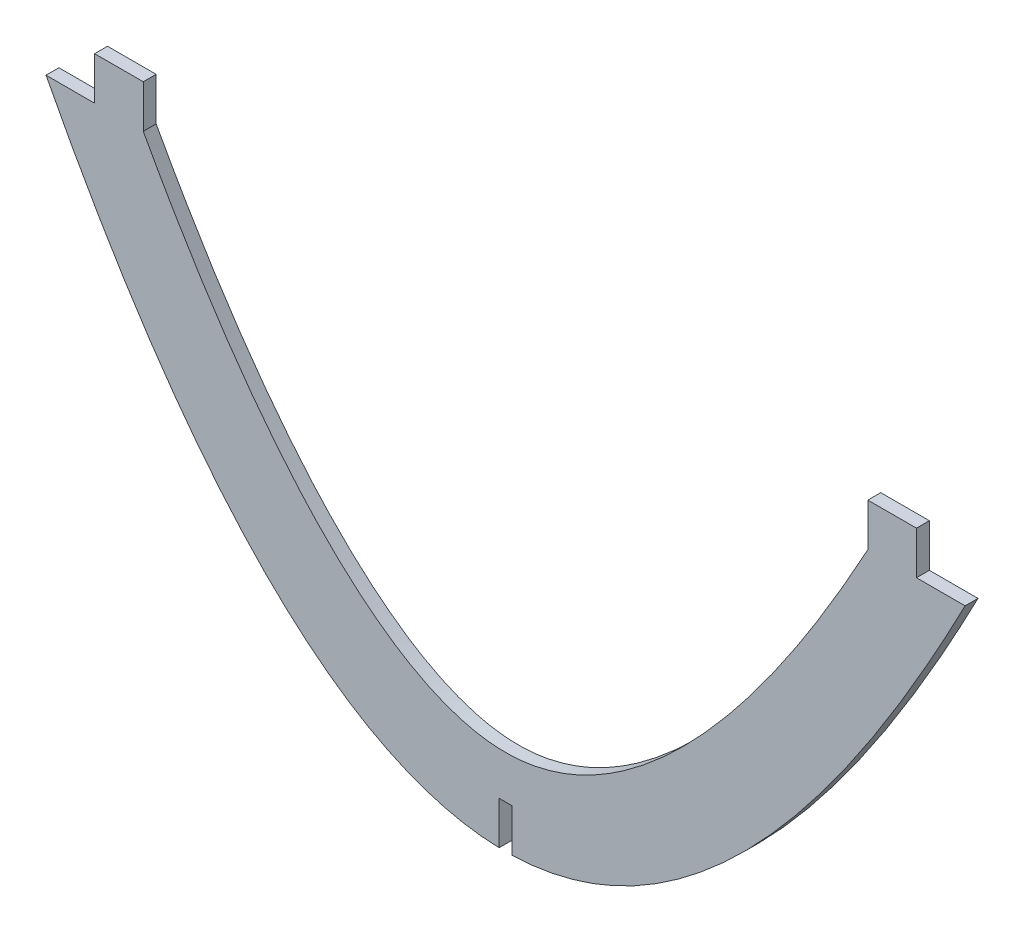
ISO-10303-21;
HEADER;
FILE_DESCRIPTION(('STEP AP214'),'2;1');
FILE_NAME('part.step','',(''),(''),'','','');
FILE_SCHEMA(('AUTOMOTIVE_DESIGN { 1 0 10303 214 1 1 1 1 }'));
ENDSEC;
DATA;
#1=APPLICATION_CONTEXT('core data for automotive mechanical design processes');
#2=APPLICATION_PROTOCOL_DEFINITION('international standard','automotive_design',2000,#1);
#3=PRODUCT_CONTEXT('',#1,'mechanical');
#4=PRODUCT('Part','Part','',(#3));
#5=PRODUCT_RELATED_PRODUCT_CATEGORY('part','',(#4));
#6=PRODUCT_DEFINITION_FORMATION('','',#4);
#7=PRODUCT_DEFINITION_CONTEXT('part definition',#1,'design');
#8=PRODUCT_DEFINITION('design','',#6,#7);
#9=PRODUCT_DEFINITION_SHAPE('','',#8);
#10=(LENGTH_UNIT() NAMED_UNIT(*) SI_UNIT(.MILLI.,.METRE.));
#11=(NAMED_UNIT(*) PLANE_ANGLE_UNIT() SI_UNIT($,.RADIAN.));
#12=(NAMED_UNIT(*) SI_UNIT($,.STERADIAN.) SOLID_ANGLE_UNIT());
#13=UNCERTAINTY_MEASURE_WITH_UNIT(LENGTH_MEASURE(1.E-05),#10,'distance_accuracy_value','');
#14=(GEOMETRIC_REPRESENTATION_CONTEXT(3) GLOBAL_UNCERTAINTY_ASSIGNED_CONTEXT((#13)) GLOBAL_UNIT_ASSIGNED_CONTEXT((#10,
#11,#12)) REPRESENTATION_CONTEXT('',''));
#15=CARTESIAN_POINT('',(0.,0.,0.));
#16=DIRECTION('',(0.,0.,1.));
#17=DIRECTION('',(1.,0.,0.));
#18=AXIS2_PLACEMENT_3D('',#15,#16,#17);
#19=CARTESIAN_POINT('',(-107.013116357136,103.066263652194,3.));
#20=CARTESIAN_POINT('',(-1.33244110189779E-11,-103.066263652168,3.));
#21=CARTESIAN_POINT('',(107.01311635711,103.066263652143,3.));
#22=B_SPLINE_CURVE_WITH_KNOTS('',2,(#19,#20,#21),.UNSPECIFIED.,.F.,.F.,(3,3),
(0.0571574881341071,0.942842511865783),.UNSPECIFIED.);
#23=DIRECTION('',(0.,0.,-1.));
#24=VECTOR('',#23,1.);
#25=SURFACE_OF_LINEAR_EXTRUSION('',#22,#24);
#26=DIRECTION('',(0.,0.,-1.));
#27=VECTOR('',#26,1.);
#28=CARTESIAN_POINT('',(1.5,0.0202500000000064,3.));
#29=LINE('',#28,#27);
#30=CARTESIAN_POINT('',(1.5,0.0202500000000064,0.));
#31=VERTEX_POINT('',#30);
#32=CARTESIAN_POINT('',(1.5,0.0202500000000064,3.));
#33=VERTEX_POINT('',#32);
#34=EDGE_CURVE('E174',#31,#33,#29,.F.);
#35=ORIENTED_EDGE('',*,*,#34,.F.);
#36=CARTESIAN_POINT('',(-107.013116357136,103.066263652194,0.));
#37=CARTESIAN_POINT('',(-1.33244110189779E-11,-103.066263652168,0.));
#38=CARTESIAN_POINT('',(107.01311635711,103.066263652143,0.));
#39=B_SPLINE_CURVE_WITH_KNOTS('',2,(#36,#37,#38),.UNSPECIFIED.,.F.,.F.,(3,3),
(0.0571574881341071,0.942842511865783),.UNSPECIFIED.);
#40=CARTESIAN_POINT('',(107.01311635711,103.066263652143,0.));
#41=VERTEX_POINT('',#40);
#42=EDGE_CURVE('E177',#31,#41,#39,.T.);
#43=ORIENTED_EDGE('',*,*,#42,.T.);
#44=DIRECTION('',(0.,0.,-1.));
#45=VECTOR('',#44,1.);
#46=CARTESIAN_POINT('',(107.01311635711,103.066263652143,3.));
#47=LINE('',#46,#45);
#48=CARTESIAN_POINT('',(107.01311635711,103.066263652143,3.));
#49=VERTEX_POINT('',#48);
#50=EDGE_CURVE('E230',#49,#41,#47,.T.);
#51=ORIENTED_EDGE('',*,*,#50,.F.);
#52=EDGE_CURVE('E258',#33,#49,#22,.T.);
#53=ORIENTED_EDGE('',*,*,#52,.F.);
#54=EDGE_LOOP('',(#35,#43,#51,#53));
#55=FACE_BOUND('',#54,.T.);
#56=ADVANCED_FACE('F39',(#55),#25,.F.);
#57=DIRECTION('',(0.,0.,-1.));
#58=VECTOR('',#57,1.);
#59=CARTESIAN_POINT('',(-1.5,0.0202500000000042,3.));
#60=LINE('',#59,#58);
#61=CARTESIAN_POINT('',(-1.5,0.0202500000000029,3.));
#62=VERTEX_POINT('',#61);
#63=CARTESIAN_POINT('',(-1.49999999999998,0.0202500000000034,0.));
#64=VERTEX_POINT('',#63);
#65=EDGE_CURVE('E55',#62,#64,#60,.T.);
#66=ORIENTED_EDGE('',*,*,#65,.F.);
#67=CARTESIAN_POINT('',(-107.013116357096,103.066263652122,3.));
#68=VERTEX_POINT('',#67);
#69=EDGE_CURVE('E254',#68,#62,#22,.T.);
#70=ORIENTED_EDGE('',*,*,#69,.F.);
#71=DIRECTION('',(0.,0.,-1.));
#72=VECTOR('',#71,1.);
#73=CARTESIAN_POINT('',(-107.013116357096,103.066263652122,3.));
#74=LINE('',#73,#72);
#75=CARTESIAN_POINT('',(-107.013116357096,103.066263652122,0.));
#76=VERTEX_POINT('',#75);
#77=EDGE_CURVE('E234',#68,#76,#74,.T.);
#78=ORIENTED_EDGE('',*,*,#77,.T.);
#79=EDGE_CURVE('E178',#76,#64,#39,.T.);
#80=ORIENTED_EDGE('',*,*,#79,.T.);
#81=EDGE_LOOP('',(#66,#70,#78,#80));
#82=FACE_BOUND('',#81,.T.);
#83=ADVANCED_FACE('F250',(#82),#25,.F.);
#84=CARTESIAN_POINT('',(-2.89867206253527E-05,19.9974258890682,3.));
#85=DIRECTION('',(0.,0.,-1.));
#86=DIRECTION('',(-1.,0.,0.));
#87=AXIS2_PLACEMENT_3D('',#84,#85,#86);
#88=PLANE('',#87);
#89=DIRECTION('',(0.,1.,0.));
#90=VECTOR('',#89,1.);
#91=CARTESIAN_POINT('',(1.5,19.9974258890682,3.));
#92=LINE('',#91,#90);
#93=CARTESIAN_POINT('',(1.5,10.,3.));
#94=VERTEX_POINT('',#93);
#95=EDGE_CURVE('E341',#33,#94,#92,.T.);
#96=ORIENTED_EDGE('',*,*,#95,.F.);
#97=ORIENTED_EDGE('',*,*,#52,.T.);
#98=DIRECTION('',(-1.,0.,0.));
#99=VECTOR('',#98,1.);
#100=CARTESIAN_POINT('',(107.013116357624,103.066263651914,3.));
#101=LINE('',#100,#99);
#102=CARTESIAN_POINT('',(95.6876138200233,103.066263651914,3.));
#103=VERTEX_POINT('',#102);
#104=EDGE_CURVE('E257',#49,#103,#101,.T.);
#105=ORIENTED_EDGE('',*,*,#104,.T.);
#106=DIRECTION('',(0.,1.,0.));
#107=VECTOR('',#106,1.);
#108=CARTESIAN_POINT('',(95.6876138200233,103.066263651914,3.));
#109=LINE('',#108,#107);
#110=CARTESIAN_POINT('',(95.6876138200233,113.066263652122,3.));
#111=VERTEX_POINT('',#110);
#112=EDGE_CURVE('E262',#103,#111,#109,.T.);
#113=ORIENTED_EDGE('',*,*,#112,.T.);
#114=DIRECTION('',(-1.,0.,0.));
#115=VECTOR('',#114,1.);
#116=CARTESIAN_POINT('',(95.6876138200233,113.066263652122,3.));
#117=LINE('',#116,#115);
#118=CARTESIAN_POINT('',(84.3621112824562,113.066263652122,3.));
#119=VERTEX_POINT('',#118);
#120=EDGE_CURVE('E323',#111,#119,#117,.T.);
#121=ORIENTED_EDGE('',*,*,#120,.T.);
#122=DIRECTION('',(0.,-1.,0.));
#123=VECTOR('',#122,1.);
#124=CARTESIAN_POINT('',(84.3621112824562,113.066263652122,3.));
#125=LINE('',#124,#123);
#126=CARTESIAN_POINT('',(84.3621112824562,103.066263652122,3.));
#127=VERTEX_POINT('',#126);
#128=EDGE_CURVE('E141',#119,#127,#125,.T.);
#129=ORIENTED_EDGE('',*,*,#128,.T.);
#130=CARTESIAN_POINT('',(89.264302067395,112.280702786458,3.));
#131=CARTESIAN_POINT('',(79.5729293370875,93.6297958532127,3.));
#132=CARTESIAN_POINT('',(60.6179731356507,63.9838720263794,3.));
#133=CARTESIAN_POINT('',(42.3691023724988,42.101536816968,3.));
#134=CARTESIAN_POINT('',(28.3080655702787,30.2983221378807,3.));
#135=CARTESIAN_POINT('',(17.9499260738012,24.1014430822762,3.));
#136=CARTESIAN_POINT('',(8.6016754251648,20.7622263557387,3.));
#137=CARTESIAN_POINT('',(-2.48932874152704E-05,19.7424947590042,3.));
#138=CARTESIAN_POINT('',(-8.60175795920534,20.7622122027813,3.));
#139=CARTESIAN_POINT('',(-17.949851696721,24.1014717277478,3.));
#140=CARTESIAN_POINT('',(-28.3089219590435,30.2980474329665,3.));
#141=CARTESIAN_POINT('',(-39.5523641363937,39.7423295411056,3.));
#142=CARTESIAN_POINT('',(-51.4440372597663,52.6053043581572,3.));
#143=CARTESIAN_POINT('',(-63.7789984766565,68.9258403154481,3.));
#144=CARTESIAN_POINT('',(-79.5722889840756,93.6292889473318,3.));
#145=CARTESIAN_POINT('',(-89.2644346965336,112.28063057416,3.));
#146=B_SPLINE_CURVE_WITH_KNOTS('',2,(#130,#131,#132,#133,#134,#135,#136,#137,#138,#139,#140,
#141,#142,#143,#144,#145),.UNSPECIFIED.,.F.,.F.,(3,1,1,1,1,1,1,1,1,1,1,1,1,1,3),
(0.0571574881320589,0.140190459107088,0.223223430082116,0.306256401057144,0.361611715040497,
0.416967029023849,0.472322343007202,0.527677656990554,0.583032970973906,0.638388284957259,
0.693743598940611,0.749098912923963,0.804454226907316,0.859809540890668,0.942842511865697),.UNSPECIFIED.);
#147=CARTESIAN_POINT('',(-84.3621112816881,103.066263651876,3.));
#148=VERTEX_POINT('',#147);
#149=EDGE_CURVE('E133',#127,#148,#146,.T.);
#150=ORIENTED_EDGE('',*,*,#149,.T.);
#151=DIRECTION('',(0.,1.,0.));
#152=VECTOR('',#151,1.);
#153=CARTESIAN_POINT('',(-84.3621112816882,113.066263652122,3.));
#154=LINE('',#153,#152);
#155=CARTESIAN_POINT('',(-84.3621112816882,113.066263652122,3.));
#156=VERTEX_POINT('',#155);
#157=EDGE_CURVE('E138',#148,#156,#154,.T.);
#158=ORIENTED_EDGE('',*,*,#157,.T.);
#159=DIRECTION('',(-1.,0.,0.));
#160=VECTOR('',#159,1.);
#161=CARTESIAN_POINT('',(-95.6876138194566,113.066263652122,3.));
#162=LINE('',#161,#160);
#163=CARTESIAN_POINT('',(-95.6876138194566,113.066263652122,3.));
#164=VERTEX_POINT('',#163);
#165=EDGE_CURVE('E64',#156,#164,#162,.T.);
#166=ORIENTED_EDGE('',*,*,#165,.T.);
#167=DIRECTION('',(0.,-1.,0.));
#168=VECTOR('',#167,1.);
#169=CARTESIAN_POINT('',(-95.6876138194566,103.066263652122,3.));
#170=LINE('',#169,#168);
#171=CARTESIAN_POINT('',(-95.6876138194566,103.066263652122,3.));
#172=VERTEX_POINT('',#171);
#173=EDGE_CURVE('E211',#164,#172,#170,.T.);
#174=ORIENTED_EDGE('',*,*,#173,.T.);
#175=DIRECTION('',(-1.,0.,0.));
#176=VECTOR('',#175,1.);
#177=CARTESIAN_POINT('',(-107.013116357096,103.066263652122,3.));
#178=LINE('',#177,#176);
#179=EDGE_CURVE('E112',#172,#68,#178,.T.);
#180=ORIENTED_EDGE('',*,*,#179,.T.);
#181=ORIENTED_EDGE('',*,*,#69,.T.);
#182=DIRECTION('',(0.,-1.,0.));
#183=VECTOR('',#182,1.);
#184=CARTESIAN_POINT('',(-1.5,19.9974258890682,3.));
#185=LINE('',#184,#183);
#186=CARTESIAN_POINT('',(-1.5,10.,3.));
#187=VERTEX_POINT('',#186);
#188=EDGE_CURVE('E351',#187,#62,#185,.T.);
#189=ORIENTED_EDGE('',*,*,#188,.F.);
#190=DIRECTION('',(-1.,0.,0.));
#191=VECTOR('',#190,1.);
#192=CARTESIAN_POINT('',(-2.89867206253527E-05,10.,3.));
#193=LINE('',#192,#191);
#194=EDGE_CURVE('E345',#94,#187,#193,.T.);
#195=ORIENTED_EDGE('',*,*,#194,.F.);
#196=EDGE_LOOP('',(#96,#97,#105,#113,#121,#129,#150,#158,#166,#174,#180,#181,#189,#195));
#197=FACE_BOUND('',#196,.T.);
#198=ADVANCED_FACE('F136',(#197),#88,.F.);
#199=CARTESIAN_POINT('',(-2.89867206253527E-05,19.9974258890682,0.));
#200=DIRECTION('',(0.,0.,-1.));
#201=DIRECTION('',(-1.,0.,0.));
#202=AXIS2_PLACEMENT_3D('',#199,#200,#201);
#203=PLANE('',#202);
#204=ORIENTED_EDGE('',*,*,#42,.F.);
#205=DIRECTION('',(0.,1.,0.));
#206=VECTOR('',#205,1.);
#207=CARTESIAN_POINT('',(1.5,19.9974258890682,0.));
#208=LINE('',#207,#206);
#209=CARTESIAN_POINT('',(1.5,10.,0.));
#210=VERTEX_POINT('',#209);
#211=EDGE_CURVE('E11',#31,#210,#208,.T.);
#212=ORIENTED_EDGE('',*,*,#211,.T.);
#213=DIRECTION('',(-1.,0.,0.));
#214=VECTOR('',#213,1.);
#215=CARTESIAN_POINT('',(-1.5,10.,0.));
#216=LINE('',#215,#214);
#217=CARTESIAN_POINT('',(-1.5,10.,0.));
#218=VERTEX_POINT('',#217);
#219=EDGE_CURVE('E364',#210,#218,#216,.T.);
#220=ORIENTED_EDGE('',*,*,#219,.T.);
#221=DIRECTION('',(0.,-1.,0.));
#222=VECTOR('',#221,1.);
#223=CARTESIAN_POINT('',(-1.5,10.,0.));
#224=LINE('',#223,#222);
#225=EDGE_CURVE('E248',#218,#64,#224,.T.);
#226=ORIENTED_EDGE('',*,*,#225,.T.);
#227=ORIENTED_EDGE('',*,*,#79,.F.);
#228=DIRECTION('',(-1.,0.,0.));
#229=VECTOR('',#228,1.);
#230=CARTESIAN_POINT('',(-107.013116357096,103.066263652122,0.));
#231=LINE('',#230,#229);
#232=CARTESIAN_POINT('',(-95.6876138194566,103.066263652122,0.));
#233=VERTEX_POINT('',#232);
#234=EDGE_CURVE('E173',#233,#76,#231,.T.);
#235=ORIENTED_EDGE('',*,*,#234,.F.);
#236=DIRECTION('',(0.,-1.,0.));
#237=VECTOR('',#236,1.);
#238=CARTESIAN_POINT('',(-95.6876138194566,103.066263652122,0.));
#239=LINE('',#238,#237);
#240=CARTESIAN_POINT('',(-95.6876138194566,113.066263652122,0.));
#241=VERTEX_POINT('',#240);
#242=EDGE_CURVE('E169',#241,#233,#239,.T.);
#243=ORIENTED_EDGE('',*,*,#242,.F.);
#244=DIRECTION('',(-1.,0.,0.));
#245=VECTOR('',#244,1.);
#246=CARTESIAN_POINT('',(-95.6876138194566,113.066263652122,0.));
#247=LINE('',#246,#245);
#248=CARTESIAN_POINT('',(-84.3621112816882,113.066263652122,0.));
#249=VERTEX_POINT('',#248);
#250=EDGE_CURVE('E103',#249,#241,#247,.T.);
#251=ORIENTED_EDGE('',*,*,#250,.F.);
#252=DIRECTION('',(0.,1.,0.));
#253=VECTOR('',#252,1.);
#254=CARTESIAN_POINT('',(-84.3621112816882,113.066263652122,0.));
#255=LINE('',#254,#253);
#256=CARTESIAN_POINT('',(-84.3621112816881,103.066263651876,0.));
#257=VERTEX_POINT('',#256);
#258=EDGE_CURVE('E203',#257,#249,#255,.T.);
#259=ORIENTED_EDGE('',*,*,#258,.F.);
#260=CARTESIAN_POINT('',(89.264302067395,112.280702786458,0.));
#261=CARTESIAN_POINT('',(79.5729293370875,93.6297958532127,0.));
#262=CARTESIAN_POINT('',(60.6179731356507,63.9838720263794,0.));
#263=CARTESIAN_POINT('',(42.3691023724988,42.101536816968,0.));
#264=CARTESIAN_POINT('',(28.3080655702787,30.2983221378807,0.));
#265=CARTESIAN_POINT('',(17.9499260738012,24.1014430822762,0.));
#266=CARTESIAN_POINT('',(8.6016754251648,20.7622263557387,0.));
#267=CARTESIAN_POINT('',(-2.48932874152704E-05,19.7424947590042,0.));
#268=CARTESIAN_POINT('',(-8.60175795920534,20.7622122027813,0.));
#269=CARTESIAN_POINT('',(-17.949851696721,24.1014717277478,0.));
#270=CARTESIAN_POINT('',(-28.3089219590435,30.2980474329665,0.));
#271=CARTESIAN_POINT('',(-39.5523641363937,39.7423295411056,0.));
#272=CARTESIAN_POINT('',(-51.4440372597663,52.6053043581572,0.));
#273=CARTESIAN_POINT('',(-63.7789984766565,68.9258403154481,0.));
#274=CARTESIAN_POINT('',(-79.5722889840756,93.6292889473318,0.));
#275=CARTESIAN_POINT('',(-89.2644346965336,112.28063057416,0.));
#276=B_SPLINE_CURVE_WITH_KNOTS('',2,(#260,#261,#262,#263,#264,#265,#266,#267,#268,#269,#270,
#271,#272,#273,#274,#275),.UNSPECIFIED.,.F.,.F.,(3,1,1,1,1,1,1,1,1,1,1,1,1,1,3),
(0.0571574881320589,0.140190459107088,0.223223430082116,0.306256401057144,0.361611715040497,
0.416967029023849,0.472322343007202,0.527677656990554,0.583032970973906,0.638388284957259,
0.693743598940611,0.749098912923963,0.804454226907316,0.859809540890668,0.942842511865697),.UNSPECIFIED.);
#277=CARTESIAN_POINT('',(84.3621112824562,103.066263652122,0.));
#278=VERTEX_POINT('',#277);
#279=EDGE_CURVE('E151',#278,#257,#276,.T.);
#280=ORIENTED_EDGE('',*,*,#279,.F.);
#281=DIRECTION('',(0.,-1.,0.));
#282=VECTOR('',#281,1.);
#283=CARTESIAN_POINT('',(84.3621112824562,113.066263652122,0.));
#284=LINE('',#283,#282);
#285=CARTESIAN_POINT('',(84.3621112824562,113.066263652122,0.));
#286=VERTEX_POINT('',#285);
#287=EDGE_CURVE('E196',#286,#278,#284,.T.);
#288=ORIENTED_EDGE('',*,*,#287,.F.);
#289=DIRECTION('',(-1.,0.,0.));
#290=VECTOR('',#289,1.);
#291=CARTESIAN_POINT('',(95.6876138200233,113.066263652122,0.));
#292=LINE('',#291,#290);
#293=CARTESIAN_POINT('',(95.6876138200233,113.066263652122,0.));
#294=VERTEX_POINT('',#293);
#295=EDGE_CURVE('E193',#294,#286,#292,.T.);
#296=ORIENTED_EDGE('',*,*,#295,.F.);
#297=DIRECTION('',(0.,1.,0.));
#298=VECTOR('',#297,1.);
#299=CARTESIAN_POINT('',(95.6876138200233,103.066263651914,0.));
#300=LINE('',#299,#298);
#301=CARTESIAN_POINT('',(95.6876138200233,103.066263651914,0.));
#302=VERTEX_POINT('',#301);
#303=EDGE_CURVE('E190',#302,#294,#300,.T.);
#304=ORIENTED_EDGE('',*,*,#303,.F.);
#305=DIRECTION('',(-1.,0.,0.));
#306=VECTOR('',#305,1.);
#307=CARTESIAN_POINT('',(107.013116357624,103.066263651914,0.));
#308=LINE('',#307,#306);
#309=EDGE_CURVE('E184',#41,#302,#308,.T.);
#310=ORIENTED_EDGE('',*,*,#309,.F.);
#311=EDGE_LOOP('',(#204,#212,#220,#226,#227,#235,#243,#251,#259,#280,#288,#296,#304,#310));
#312=FACE_BOUND('',#311,.T.);
#313=ADVANCED_FACE('F245',(#312),#203,.T.);
#314=CARTESIAN_POINT('',(-95.6876138194566,103.066263652122,3.));
#315=DIRECTION('',(1.,0.,0.));
#316=DIRECTION('',(0.,0.,-1.));
#317=AXIS2_PLACEMENT_3D('',#314,#315,#316);
#318=PLANE('',#317);
#319=ORIENTED_EDGE('',*,*,#242,.T.);
#320=DIRECTION('',(0.,0.,-1.));
#321=VECTOR('',#320,1.);
#322=CARTESIAN_POINT('',(-95.6876138194566,103.066263652122,3.));
#323=LINE('',#322,#321);
#324=EDGE_CURVE('E48',#172,#233,#323,.T.);
#325=ORIENTED_EDGE('',*,*,#324,.F.);
#326=ORIENTED_EDGE('',*,*,#173,.F.);
#327=DIRECTION('',(0.,0.,-1.));
#328=VECTOR('',#327,1.);
#329=CARTESIAN_POINT('',(-95.6876138194566,113.066263652122,3.));
#330=LINE('',#329,#328);
#331=EDGE_CURVE('E162',#164,#241,#330,.T.);
#332=ORIENTED_EDGE('',*,*,#331,.T.);
#333=EDGE_LOOP('',(#319,#325,#326,#332));
#334=FACE_BOUND('',#333,.T.);
#335=ADVANCED_FACE('F41',(#334),#318,.F.);
#336=CARTESIAN_POINT('',(-107.013116357096,103.066263652122,3.));
#337=DIRECTION('',(0.,-1.,0.));
#338=DIRECTION('',(0.,0.,-1.));
#339=AXIS2_PLACEMENT_3D('',#336,#337,#338);
#340=PLANE('',#339);
#341=ORIENTED_EDGE('',*,*,#234,.T.);
#342=ORIENTED_EDGE('',*,*,#77,.F.);
#343=ORIENTED_EDGE('',*,*,#179,.F.);
#344=ORIENTED_EDGE('',*,*,#324,.T.);
#345=EDGE_LOOP('',(#341,#342,#343,#344));
#346=FACE_BOUND('',#345,.T.);
#347=ADVANCED_FACE('F239',(#346),#340,.F.);
#348=CARTESIAN_POINT('',(107.013116357624,103.066263651914,3.));
#349=DIRECTION('',(0.,-1.,0.));
#350=DIRECTION('',(0.,0.,-1.));
#351=AXIS2_PLACEMENT_3D('',#348,#349,#350);
#352=PLANE('',#351);
#353=ORIENTED_EDGE('',*,*,#309,.T.);
#354=DIRECTION('',(0.,0.,-1.));
#355=VECTOR('',#354,1.);
#356=CARTESIAN_POINT('',(95.6876138200233,103.066263651914,3.));
#357=LINE('',#356,#355);
#358=EDGE_CURVE('E226',#103,#302,#357,.T.);
#359=ORIENTED_EDGE('',*,*,#358,.F.);
#360=ORIENTED_EDGE('',*,*,#104,.F.);
#361=ORIENTED_EDGE('',*,*,#50,.T.);
#362=EDGE_LOOP('',(#353,#359,#360,#361));
#363=FACE_BOUND('',#362,.T.);
#364=ADVANCED_FACE('F277',(#363),#352,.F.);
#365=CARTESIAN_POINT('',(95.6876138200233,103.066263651914,3.));
#366=DIRECTION('',(-1.,0.,0.));
#367=DIRECTION('',(0.,0.,1.));
#368=AXIS2_PLACEMENT_3D('',#365,#366,#367);
#369=PLANE('',#368);
#370=ORIENTED_EDGE('',*,*,#303,.T.);
#371=DIRECTION('',(0.,0.,-1.));
#372=VECTOR('',#371,1.);
#373=CARTESIAN_POINT('',(95.6876138200233,113.066263652122,3.));
#374=LINE('',#373,#372);
#375=EDGE_CURVE('E222',#111,#294,#374,.T.);
#376=ORIENTED_EDGE('',*,*,#375,.F.);
#377=ORIENTED_EDGE('',*,*,#112,.F.);
#378=ORIENTED_EDGE('',*,*,#358,.T.);
#379=EDGE_LOOP('',(#370,#376,#377,#378));
#380=FACE_BOUND('',#379,.T.);
#381=ADVANCED_FACE('F284',(#380),#369,.F.);
#382=CARTESIAN_POINT('',(95.6876138200233,113.066263652122,3.));
#383=DIRECTION('',(0.,-1.,0.));
#384=DIRECTION('',(0.,0.,-1.));
#385=AXIS2_PLACEMENT_3D('',#382,#383,#384);
#386=PLANE('',#385);
#387=ORIENTED_EDGE('',*,*,#295,.T.);
#388=DIRECTION('',(0.,0.,-1.));
#389=VECTOR('',#388,1.);
#390=CARTESIAN_POINT('',(84.3621112824562,113.066263652122,3.));
#391=LINE('',#390,#389);
#392=EDGE_CURVE('E218',#119,#286,#391,.T.);
#393=ORIENTED_EDGE('',*,*,#392,.F.);
#394=ORIENTED_EDGE('',*,*,#120,.F.);
#395=ORIENTED_EDGE('',*,*,#375,.T.);
#396=EDGE_LOOP('',(#387,#393,#394,#395));
#397=FACE_BOUND('',#396,.T.);
#398=ADVANCED_FACE('F307',(#397),#386,.F.);
#399=CARTESIAN_POINT('',(84.3621112824562,113.066263652122,3.));
#400=DIRECTION('',(1.,0.,0.));
#401=DIRECTION('',(0.,0.,-1.));
#402=AXIS2_PLACEMENT_3D('',#399,#400,#401);
#403=PLANE('',#402);
#404=ORIENTED_EDGE('',*,*,#287,.T.);
#405=DIRECTION('',(0.,0.,-1.));
#406=VECTOR('',#405,1.);
#407=CARTESIAN_POINT('',(84.3621112824562,103.066263652122,3.));
#408=LINE('',#407,#406);
#409=EDGE_CURVE('E155',#127,#278,#408,.T.);
#410=ORIENTED_EDGE('',*,*,#409,.F.);
#411=ORIENTED_EDGE('',*,*,#128,.F.);
#412=ORIENTED_EDGE('',*,*,#392,.T.);
#413=EDGE_LOOP('',(#404,#410,#411,#412));
#414=FACE_BOUND('',#413,.T.);
#415=ADVANCED_FACE('F304',(#414),#403,.F.);
#416=DIRECTION('',(0.,0.,-1.));
#417=VECTOR('',#416,1.);
#418=SURFACE_OF_LINEAR_EXTRUSION('',#146,#417);
#419=ORIENTED_EDGE('',*,*,#279,.T.);
#420=DIRECTION('',(0.,0.,-1.));
#421=VECTOR('',#420,1.);
#422=CARTESIAN_POINT('',(-84.3621112816881,103.066263651876,3.));
#423=LINE('',#422,#421);
#424=EDGE_CURVE('E148',#148,#257,#423,.T.);
#425=ORIENTED_EDGE('',*,*,#424,.F.);
#426=ORIENTED_EDGE('',*,*,#149,.F.);
#427=ORIENTED_EDGE('',*,*,#409,.T.);
#428=EDGE_LOOP('',(#419,#425,#426,#427));
#429=FACE_BOUND('',#428,.T.);
#430=ADVANCED_FACE('F149',(#429),#418,.F.);
#431=CARTESIAN_POINT('',(-84.3621112816882,113.066263652122,3.));
#432=DIRECTION('',(-1.,0.,0.));
#433=DIRECTION('',(0.,0.,1.));
#434=AXIS2_PLACEMENT_3D('',#431,#432,#433);
#435=PLANE('',#434);
#436=ORIENTED_EDGE('',*,*,#258,.T.);
#437=DIRECTION('',(0.,0.,-1.));
#438=VECTOR('',#437,1.);
#439=CARTESIAN_POINT('',(-84.3621112816882,113.066263652122,3.));
#440=LINE('',#439,#438);
#441=EDGE_CURVE('E156',#156,#249,#440,.T.);
#442=ORIENTED_EDGE('',*,*,#441,.F.);
#443=ORIENTED_EDGE('',*,*,#157,.F.);
#444=ORIENTED_EDGE('',*,*,#424,.T.);
#445=EDGE_LOOP('',(#436,#442,#443,#444));
#446=FACE_BOUND('',#445,.T.);
#447=ADVANCED_FACE('F158',(#446),#435,.F.);
#448=CARTESIAN_POINT('',(-95.6876138194566,113.066263652122,3.));
#449=DIRECTION('',(0.,-1.,0.));
#450=DIRECTION('',(0.,0.,-1.));
#451=AXIS2_PLACEMENT_3D('',#448,#449,#450);
#452=PLANE('',#451);
#453=ORIENTED_EDGE('',*,*,#250,.T.);
#454=ORIENTED_EDGE('',*,*,#331,.F.);
#455=ORIENTED_EDGE('',*,*,#165,.F.);
#456=ORIENTED_EDGE('',*,*,#441,.T.);
#457=EDGE_LOOP('',(#453,#454,#455,#456));
#458=FACE_BOUND('',#457,.T.);
#459=ADVANCED_FACE('F296',(#458),#452,.F.);
#460=CARTESIAN_POINT('',(1.5,10.,16.));
#461=DIRECTION('',(-1.,0.,0.));
#462=DIRECTION('',(0.,0.,1.));
#463=AXIS2_PLACEMENT_3D('',#460,#461,#462);
#464=PLANE('',#463);
#465=ORIENTED_EDGE('',*,*,#34,.T.);
#466=ORIENTED_EDGE('',*,*,#95,.T.);
#467=DIRECTION('',(0.,0.,-1.));
#468=VECTOR('',#467,1.);
#469=CARTESIAN_POINT('',(1.5,10.,16.));
#470=LINE('',#469,#468);
#471=EDGE_CURVE('E354',#94,#210,#470,.T.);
#472=ORIENTED_EDGE('',*,*,#471,.T.);
#473=ORIENTED_EDGE('',*,*,#211,.F.);
#474=EDGE_LOOP('',(#465,#466,#472,#473));
#475=FACE_BOUND('',#474,.T.);
#476=ADVANCED_FACE('F299',(#475),#464,.T.);
#477=CARTESIAN_POINT('',(-1.5,10.,16.));
#478=DIRECTION('',(0.,-1.,0.));
#479=DIRECTION('',(0.,0.,-1.));
#480=AXIS2_PLACEMENT_3D('',#477,#478,#479);
#481=PLANE('',#480);
#482=ORIENTED_EDGE('',*,*,#194,.T.);
#483=DIRECTION('',(0.,0.,-1.));
#484=VECTOR('',#483,1.);
#485=CARTESIAN_POINT('',(-1.5,10.,16.));
#486=LINE('',#485,#484);
#487=EDGE_CURVE('E358',#187,#218,#486,.T.);
#488=ORIENTED_EDGE('',*,*,#487,.T.);
#489=ORIENTED_EDGE('',*,*,#219,.F.);
#490=ORIENTED_EDGE('',*,*,#471,.F.);
#491=EDGE_LOOP('',(#482,#488,#489,#490));
#492=FACE_BOUND('',#491,.T.);
#493=ADVANCED_FACE('F375',(#492),#481,.T.);
#494=CARTESIAN_POINT('',(-1.5,10.,16.));
#495=DIRECTION('',(1.,0.,0.));
#496=DIRECTION('',(0.,0.,-1.));
#497=AXIS2_PLACEMENT_3D('',#494,#495,#496);
#498=PLANE('',#497);
#499=ORIENTED_EDGE('',*,*,#65,.T.);
#500=ORIENTED_EDGE('',*,*,#225,.F.);
#501=ORIENTED_EDGE('',*,*,#487,.F.);
#502=ORIENTED_EDGE('',*,*,#188,.T.);
#503=EDGE_LOOP('',(#499,#500,#501,#502));
#504=FACE_BOUND('',#503,.T.);
#505=ADVANCED_FACE('F383',(#504),#498,.T.);
#506=CLOSED_SHELL('',(#56,#83,#198,#313,#335,#347,#364,#381,#398,#415,#430,#447,#459,#476,#493,#505));
#507=MANIFOLD_SOLID_BREP('B2',#506);
#508=ADVANCED_BREP_SHAPE_REPRESENTATION('',(#18,#507),#14);
#509=SHAPE_DEFINITION_REPRESENTATION(#9,#508);
ENDSEC;
END-ISO-10303-21;
